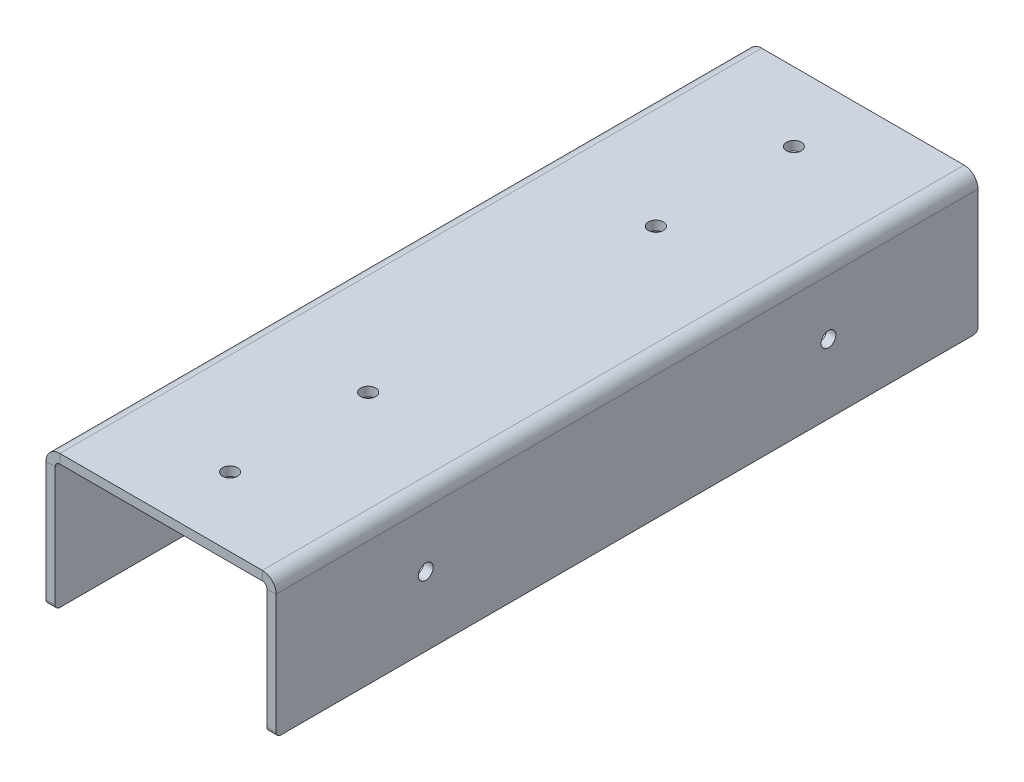
ISO-10303-21;
HEADER;
FILE_DESCRIPTION(('STEP AP214'),'2;1');
FILE_NAME('part.step','',(''),(''),'','','');
FILE_SCHEMA(('AUTOMOTIVE_DESIGN { 1 0 10303 214 1 1 1 1 }'));
ENDSEC;
DATA;
#1=APPLICATION_CONTEXT('core data for automotive mechanical design processes');
#2=APPLICATION_PROTOCOL_DEFINITION('international standard','automotive_design',2000,#1);
#3=PRODUCT_CONTEXT('',#1,'mechanical');
#4=PRODUCT('Part','Part','',(#3));
#5=PRODUCT_RELATED_PRODUCT_CATEGORY('part','',(#4));
#6=PRODUCT_DEFINITION_FORMATION('','',#4);
#7=PRODUCT_DEFINITION_CONTEXT('part definition',#1,'design');
#8=PRODUCT_DEFINITION('design','',#6,#7);
#9=PRODUCT_DEFINITION_SHAPE('','',#8);
#10=(LENGTH_UNIT() NAMED_UNIT(*) SI_UNIT(.MILLI.,.METRE.));
#11=(NAMED_UNIT(*) PLANE_ANGLE_UNIT() SI_UNIT($,.RADIAN.));
#12=(NAMED_UNIT(*) SI_UNIT($,.STERADIAN.) SOLID_ANGLE_UNIT());
#13=UNCERTAINTY_MEASURE_WITH_UNIT(LENGTH_MEASURE(1.E-05),#10,'distance_accuracy_value','');
#14=(GEOMETRIC_REPRESENTATION_CONTEXT(3) GLOBAL_UNCERTAINTY_ASSIGNED_CONTEXT((#13)) GLOBAL_UNIT_ASSIGNED_CONTEXT((#10,
#11,#12)) REPRESENTATION_CONTEXT('',''));
#15=CARTESIAN_POINT('',(0.,0.,0.));
#16=DIRECTION('',(0.,0.,1.));
#17=DIRECTION('',(1.,0.,0.));
#18=AXIS2_PLACEMENT_3D('',#15,#16,#17);
#19=CARTESIAN_POINT('',(-50.,-4.,152.5));
#20=DIRECTION('',(0.,0.,1.));
#21=DIRECTION('',(1.,0.,0.));
#22=AXIS2_PLACEMENT_3D('',#19,#20,#21);
#23=PLANE('',#22);
#24=DIRECTION('',(0.,-1.,0.));
#25=VECTOR('',#24,1.);
#26=CARTESIAN_POINT('',(44.,-4.,152.5));
#27=LINE('',#26,#25);
#28=CARTESIAN_POINT('',(44.,0.,152.5));
#29=VERTEX_POINT('',#28);
#30=CARTESIAN_POINT('',(44.,-4.,152.5));
#31=VERTEX_POINT('',#30);
#32=EDGE_CURVE('E263',#29,#31,#27,.T.);
#33=ORIENTED_EDGE('',*,*,#32,.F.);
#34=DIRECTION('',(1.,0.,0.));
#35=VECTOR('',#34,1.);
#36=CARTESIAN_POINT('',(-50.,0.,152.5));
#37=LINE('',#36,#35);
#38=CARTESIAN_POINT('',(-44.,0.,152.5));
#39=VERTEX_POINT('',#38);
#40=EDGE_CURVE('E238',#39,#29,#37,.T.);
#41=ORIENTED_EDGE('',*,*,#40,.F.);
#42=DIRECTION('',(0.,-1.,0.));
#43=VECTOR('',#42,1.);
#44=CARTESIAN_POINT('',(-44.,-4.,152.5));
#45=LINE('',#44,#43);
#46=CARTESIAN_POINT('',(-44.,-4.,152.5));
#47=VERTEX_POINT('',#46);
#48=EDGE_CURVE('E261',#39,#47,#45,.T.);
#49=ORIENTED_EDGE('',*,*,#48,.T.);
#50=DIRECTION('',(1.,0.,0.));
#51=VECTOR('',#50,1.);
#52=CARTESIAN_POINT('',(-50.,-4.,152.5));
#53=LINE('',#52,#51);
#54=EDGE_CURVE('E187',#47,#31,#53,.T.);
#55=ORIENTED_EDGE('',*,*,#54,.T.);
#56=EDGE_LOOP('',(#33,#41,#49,#55));
#57=FACE_BOUND('',#56,.T.);
#58=ADVANCED_FACE('F39',(#57),#23,.T.);
#59=CARTESIAN_POINT('',(-44.,-6.,152.5));
#60=DIRECTION('',(0.,0.,1.));
#61=DIRECTION('',(1.,0.,0.));
#62=AXIS2_PLACEMENT_3D('',#59,#60,#61);
#63=PLANE('',#62);
#64=ORIENTED_EDGE('',*,*,#48,.F.);
#65=CARTESIAN_POINT('',(-44.,-6.,152.5));
#66=DIRECTION('',(0.,0.,1.));
#67=DIRECTION('',(1.,0.,0.));
#68=AXIS2_PLACEMENT_3D('',#65,#66,#67);
#69=CIRCLE('',#68,6.);
#70=CARTESIAN_POINT('',(-50.,-5.99999999999999,152.5));
#71=VERTEX_POINT('',#70);
#72=EDGE_CURVE('E239',#39,#71,#69,.T.);
#73=ORIENTED_EDGE('',*,*,#72,.T.);
#74=DIRECTION('',(1.,0.,0.));
#75=VECTOR('',#74,1.);
#76=CARTESIAN_POINT('',(-46.,-6.,152.5));
#77=LINE('',#76,#75);
#78=CARTESIAN_POINT('',(-46.,-6.,152.5));
#79=VERTEX_POINT('',#78);
#80=EDGE_CURVE('E258',#71,#79,#77,.T.);
#81=ORIENTED_EDGE('',*,*,#80,.T.);
#82=CARTESIAN_POINT('',(-44.,-6.,152.5));
#83=DIRECTION('',(0.,0.,-1.));
#84=DIRECTION('',(-1.,0.,0.));
#85=AXIS2_PLACEMENT_3D('',#82,#83,#84);
#86=CIRCLE('',#85,2.);
#87=EDGE_CURVE('E178',#47,#79,#86,.F.);
#88=ORIENTED_EDGE('',*,*,#87,.F.);
#89=EDGE_LOOP('',(#64,#73,#81,#88));
#90=FACE_BOUND('',#89,.T.);
#91=ADVANCED_FACE('F403',(#90),#63,.T.);
#92=CARTESIAN_POINT('',(-46.,-60.,152.5));
#93=DIRECTION('',(0.,0.,1.));
#94=DIRECTION('',(0.,1.,0.));
#95=AXIS2_PLACEMENT_3D('',#92,#93,#94);
#96=PLANE('',#95);
#97=DIRECTION('',(0.,1.,0.));
#98=VECTOR('',#97,1.);
#99=CARTESIAN_POINT('',(-50.,-60.,152.5));
#100=LINE('',#99,#98);
#101=CARTESIAN_POINT('',(-50.,-58.,152.5));
#102=VERTEX_POINT('',#101);
#103=EDGE_CURVE('E243',#102,#71,#100,.T.);
#104=ORIENTED_EDGE('',*,*,#103,.F.);
#105=DIRECTION('',(-1.,0.,0.));
#106=VECTOR('',#105,1.);
#107=CARTESIAN_POINT('',(-46.,-58.,152.5));
#108=LINE('',#107,#106);
#109=CARTESIAN_POINT('',(-46.,-58.,152.5));
#110=VERTEX_POINT('',#109);
#111=EDGE_CURVE('E11',#102,#110,#108,.F.);
#112=ORIENTED_EDGE('',*,*,#111,.T.);
#113=DIRECTION('',(0.,1.,0.));
#114=VECTOR('',#113,1.);
#115=CARTESIAN_POINT('',(-46.,-60.,152.5));
#116=LINE('',#115,#114);
#117=EDGE_CURVE('E318',#110,#79,#116,.T.);
#118=ORIENTED_EDGE('',*,*,#117,.T.);
#119=ORIENTED_EDGE('',*,*,#80,.F.);
#120=EDGE_LOOP('',(#104,#112,#118,#119));
#121=FACE_BOUND('',#120,.T.);
#122=ADVANCED_FACE('F409',(#121),#96,.T.);
#123=CARTESIAN_POINT('',(-46.,-60.,152.5));
#124=DIRECTION('',(0.,1.,0.));
#125=DIRECTION('',(0.,0.,-1.));
#126=AXIS2_PLACEMENT_3D('',#123,#124,#125);
#127=PLANE('',#126);
#128=DIRECTION('',(0.,0.,1.));
#129=VECTOR('',#128,1.);
#130=CARTESIAN_POINT('',(-50.,-60.,152.5));
#131=LINE('',#130,#129);
#132=CARTESIAN_POINT('',(-50.,-60.,150.5));
#133=VERTEX_POINT('',#132);
#134=CARTESIAN_POINT('',(-50.,-60.,-150.5));
#135=VERTEX_POINT('',#134);
#136=EDGE_CURVE('E230',#133,#135,#131,.F.);
#137=ORIENTED_EDGE('',*,*,#136,.T.);
#138=DIRECTION('',(-1.,0.,0.));
#139=VECTOR('',#138,1.);
#140=CARTESIAN_POINT('',(-46.,-60.,-150.5));
#141=LINE('',#140,#139);
#142=CARTESIAN_POINT('',(-46.,-60.,-150.5));
#143=VERTEX_POINT('',#142);
#144=EDGE_CURVE('E268',#135,#143,#141,.F.);
#145=ORIENTED_EDGE('',*,*,#144,.T.);
#146=DIRECTION('',(0.,0.,-1.));
#147=VECTOR('',#146,1.);
#148=CARTESIAN_POINT('',(-46.,-60.,152.5));
#149=LINE('',#148,#147);
#150=CARTESIAN_POINT('',(-46.,-60.,150.5));
#151=VERTEX_POINT('',#150);
#152=EDGE_CURVE('E313',#151,#143,#149,.T.);
#153=ORIENTED_EDGE('',*,*,#152,.F.);
#154=DIRECTION('',(1.,0.,0.));
#155=VECTOR('',#154,1.);
#156=CARTESIAN_POINT('',(-46.,-60.,150.5));
#157=LINE('',#156,#155);
#158=EDGE_CURVE('E265',#151,#133,#157,.F.);
#159=ORIENTED_EDGE('',*,*,#158,.T.);
#160=EDGE_LOOP('',(#137,#145,#153,#159));
#161=FACE_BOUND('',#160,.T.);
#162=ADVANCED_FACE('F492',(#161),#127,.F.);
#163=CARTESIAN_POINT('',(-46.,-60.,-152.5));
#164=DIRECTION('',(0.,0.,1.));
#165=DIRECTION('',(0.,1.,0.));
#166=AXIS2_PLACEMENT_3D('',#163,#164,#165);
#167=PLANE('',#166);
#168=DIRECTION('',(0.,1.,0.));
#169=VECTOR('',#168,1.);
#170=CARTESIAN_POINT('',(-46.,-60.,-152.5));
#171=LINE('',#170,#169);
#172=CARTESIAN_POINT('',(-46.,-58.,-152.5));
#173=VERTEX_POINT('',#172);
#174=CARTESIAN_POINT('',(-46.,-6.,-152.5));
#175=VERTEX_POINT('',#174);
#176=EDGE_CURVE('E320',#173,#175,#171,.T.);
#177=ORIENTED_EDGE('',*,*,#176,.F.);
#178=DIRECTION('',(-1.,0.,0.));
#179=VECTOR('',#178,1.);
#180=CARTESIAN_POINT('',(-46.,-58.,-152.5));
#181=LINE('',#180,#179);
#182=CARTESIAN_POINT('',(-50.,-58.,-152.5));
#183=VERTEX_POINT('',#182);
#184=EDGE_CURVE('E275',#173,#183,#181,.T.);
#185=ORIENTED_EDGE('',*,*,#184,.T.);
#186=DIRECTION('',(0.,1.,0.));
#187=VECTOR('',#186,1.);
#188=CARTESIAN_POINT('',(-50.,-60.,-152.5));
#189=LINE('',#188,#187);
#190=CARTESIAN_POINT('',(-50.,-6.,-152.5));
#191=VERTEX_POINT('',#190);
#192=EDGE_CURVE('E241',#183,#191,#189,.T.);
#193=ORIENTED_EDGE('',*,*,#192,.T.);
#194=DIRECTION('',(1.,0.,0.));
#195=VECTOR('',#194,1.);
#196=CARTESIAN_POINT('',(-46.,-6.,-152.5));
#197=LINE('',#196,#195);
#198=EDGE_CURVE('E167',#191,#175,#197,.T.);
#199=ORIENTED_EDGE('',*,*,#198,.T.);
#200=EDGE_LOOP('',(#177,#185,#193,#199));
#201=FACE_BOUND('',#200,.T.);
#202=ADVANCED_FACE('F457',(#201),#167,.F.);
#203=CARTESIAN_POINT('',(-44.,-6.,-152.5));
#204=DIRECTION('',(0.,0.,-1.));
#205=DIRECTION('',(-1.,0.,0.));
#206=AXIS2_PLACEMENT_3D('',#203,#204,#205);
#207=PLANE('',#206);
#208=ORIENTED_EDGE('',*,*,#198,.F.);
#209=CARTESIAN_POINT('',(-44.,-6.,-152.5));
#210=DIRECTION('',(0.,0.,1.));
#211=DIRECTION('',(1.,0.,0.));
#212=AXIS2_PLACEMENT_3D('',#209,#210,#211);
#213=CIRCLE('',#212,6.);
#214=CARTESIAN_POINT('',(-44.,0.,-152.5));
#215=VERTEX_POINT('',#214);
#216=EDGE_CURVE('E162',#191,#215,#213,.F.);
#217=ORIENTED_EDGE('',*,*,#216,.T.);
#218=DIRECTION('',(0.,-1.,0.));
#219=VECTOR('',#218,1.);
#220=CARTESIAN_POINT('',(-44.,-4.,-152.5));
#221=LINE('',#220,#219);
#222=CARTESIAN_POINT('',(-44.,-4.,-152.5));
#223=VERTEX_POINT('',#222);
#224=EDGE_CURVE('E155',#215,#223,#221,.T.);
#225=ORIENTED_EDGE('',*,*,#224,.T.);
#226=CARTESIAN_POINT('',(-44.,-6.,-152.5));
#227=DIRECTION('',(0.,0.,1.));
#228=DIRECTION('',(1.,0.,0.));
#229=AXIS2_PLACEMENT_3D('',#226,#227,#228);
#230=CIRCLE('',#229,2.);
#231=EDGE_CURVE('E159',#175,#223,#230,.F.);
#232=ORIENTED_EDGE('',*,*,#231,.F.);
#233=EDGE_LOOP('',(#208,#217,#225,#232));
#234=FACE_BOUND('',#233,.T.);
#235=ADVANCED_FACE('F158',(#234),#207,.T.);
#236=CARTESIAN_POINT('',(-50.,-4.,-152.5));
#237=DIRECTION('',(0.,0.,1.));
#238=DIRECTION('',(1.,0.,0.));
#239=AXIS2_PLACEMENT_3D('',#236,#237,#238);
#240=PLANE('',#239);
#241=ORIENTED_EDGE('',*,*,#224,.F.);
#242=DIRECTION('',(1.,0.,0.));
#243=VECTOR('',#242,1.);
#244=CARTESIAN_POINT('',(-50.,0.,-152.5));
#245=LINE('',#244,#243);
#246=CARTESIAN_POINT('',(44.,0.,-152.5));
#247=VERTEX_POINT('',#246);
#248=EDGE_CURVE('E236',#215,#247,#245,.T.);
#249=ORIENTED_EDGE('',*,*,#248,.T.);
#250=DIRECTION('',(0.,-1.,0.));
#251=VECTOR('',#250,1.);
#252=CARTESIAN_POINT('',(44.,-4.,-152.5));
#253=LINE('',#252,#251);
#254=CARTESIAN_POINT('',(44.,-4.,-152.5));
#255=VERTEX_POINT('',#254);
#256=EDGE_CURVE('E168',#247,#255,#253,.T.);
#257=ORIENTED_EDGE('',*,*,#256,.T.);
#258=DIRECTION('',(1.,0.,0.));
#259=VECTOR('',#258,1.);
#260=CARTESIAN_POINT('',(-50.,-4.,-152.5));
#261=LINE('',#260,#259);
#262=EDGE_CURVE('E182',#223,#255,#261,.T.);
#263=ORIENTED_EDGE('',*,*,#262,.F.);
#264=EDGE_LOOP('',(#241,#249,#257,#263));
#265=FACE_BOUND('',#264,.T.);
#266=ADVANCED_FACE('F183',(#265),#240,.F.);
#267=CARTESIAN_POINT('',(44.,-6.,-152.5));
#268=DIRECTION('',(0.,0.,1.));
#269=DIRECTION('',(1.,0.,0.));
#270=AXIS2_PLACEMENT_3D('',#267,#268,#269);
#271=PLANE('',#270);
#272=ORIENTED_EDGE('',*,*,#256,.F.);
#273=CARTESIAN_POINT('',(44.,-6.,-152.5));
#274=DIRECTION('',(0.,0.,1.));
#275=DIRECTION('',(1.,0.,0.));
#276=AXIS2_PLACEMENT_3D('',#273,#274,#275);
#277=CIRCLE('',#276,6.);
#278=CARTESIAN_POINT('',(50.,-6.,-152.5));
#279=VERTEX_POINT('',#278);
#280=EDGE_CURVE('E231',#247,#279,#277,.F.);
#281=ORIENTED_EDGE('',*,*,#280,.T.);
#282=DIRECTION('',(-1.,0.,0.));
#283=VECTOR('',#282,1.);
#284=CARTESIAN_POINT('',(46.,-6.,-152.5));
#285=LINE('',#284,#283);
#286=CARTESIAN_POINT('',(46.,-6.,-152.5));
#287=VERTEX_POINT('',#286);
#288=EDGE_CURVE('E253',#279,#287,#285,.T.);
#289=ORIENTED_EDGE('',*,*,#288,.T.);
#290=CARTESIAN_POINT('',(44.,-6.,-152.5));
#291=DIRECTION('',(0.,0.,-1.));
#292=DIRECTION('',(-1.,0.,0.));
#293=AXIS2_PLACEMENT_3D('',#290,#291,#292);
#294=CIRCLE('',#293,2.);
#295=EDGE_CURVE('E207',#255,#287,#294,.T.);
#296=ORIENTED_EDGE('',*,*,#295,.F.);
#297=EDGE_LOOP('',(#272,#281,#289,#296));
#298=FACE_BOUND('',#297,.T.);
#299=ADVANCED_FACE('F441',(#298),#271,.F.);
#300=CARTESIAN_POINT('',(46.,0.,-152.5));
#301=DIRECTION('',(0.,0.,-1.));
#302=DIRECTION('',(0.,1.,0.));
#303=AXIS2_PLACEMENT_3D('',#300,#301,#302);
#304=PLANE('',#303);
#305=DIRECTION('',(0.,1.,0.));
#306=VECTOR('',#305,1.);
#307=CARTESIAN_POINT('',(50.,0.,-152.5));
#308=LINE('',#307,#306);
#309=CARTESIAN_POINT('',(50.,-58.,-152.5));
#310=VERTEX_POINT('',#309);
#311=EDGE_CURVE('E227',#279,#310,#308,.F.);
#312=ORIENTED_EDGE('',*,*,#311,.T.);
#313=DIRECTION('',(-1.,0.,0.));
#314=VECTOR('',#313,1.);
#315=CARTESIAN_POINT('',(46.,-58.,-152.5));
#316=LINE('',#315,#314);
#317=CARTESIAN_POINT('',(46.,-58.,-152.5));
#318=VERTEX_POINT('',#317);
#319=EDGE_CURVE('E281',#310,#318,#316,.T.);
#320=ORIENTED_EDGE('',*,*,#319,.T.);
#321=DIRECTION('',(0.,1.,0.));
#322=VECTOR('',#321,1.);
#323=CARTESIAN_POINT('',(46.,0.,-152.5));
#324=LINE('',#323,#322);
#325=EDGE_CURVE('E310',#287,#318,#324,.F.);
#326=ORIENTED_EDGE('',*,*,#325,.F.);
#327=ORIENTED_EDGE('',*,*,#288,.F.);
#328=EDGE_LOOP('',(#312,#320,#326,#327));
#329=FACE_BOUND('',#328,.T.);
#330=ADVANCED_FACE('F303',(#329),#304,.T.);
#331=CARTESIAN_POINT('',(46.,-60.,152.5));
#332=DIRECTION('',(0.,-1.,0.));
#333=DIRECTION('',(0.,0.,-1.));
#334=AXIS2_PLACEMENT_3D('',#331,#332,#333);
#335=PLANE('',#334);
#336=DIRECTION('',(0.,0.,-1.));
#337=VECTOR('',#336,1.);
#338=CARTESIAN_POINT('',(46.,-60.,152.5));
#339=LINE('',#338,#337);
#340=CARTESIAN_POINT('',(46.,-60.,150.5));
#341=VERTEX_POINT('',#340);
#342=CARTESIAN_POINT('',(46.,-60.,-150.5));
#343=VERTEX_POINT('',#342);
#344=EDGE_CURVE('E197',#341,#343,#339,.T.);
#345=ORIENTED_EDGE('',*,*,#344,.T.);
#346=DIRECTION('',(-1.,0.,0.));
#347=VECTOR('',#346,1.);
#348=CARTESIAN_POINT('',(46.,-60.,-150.5));
#349=LINE('',#348,#347);
#350=CARTESIAN_POINT('',(50.,-60.,-150.5));
#351=VERTEX_POINT('',#350);
#352=EDGE_CURVE('E61',#343,#351,#349,.F.);
#353=ORIENTED_EDGE('',*,*,#352,.T.);
#354=DIRECTION('',(0.,0.,-1.));
#355=VECTOR('',#354,1.);
#356=CARTESIAN_POINT('',(50.,-60.,152.5));
#357=LINE('',#356,#355);
#358=CARTESIAN_POINT('',(50.,-60.,150.5));
#359=VERTEX_POINT('',#358);
#360=EDGE_CURVE('E225',#359,#351,#357,.T.);
#361=ORIENTED_EDGE('',*,*,#360,.F.);
#362=DIRECTION('',(1.,0.,0.));
#363=VECTOR('',#362,1.);
#364=CARTESIAN_POINT('',(46.,-60.,150.5));
#365=LINE('',#364,#363);
#366=EDGE_CURVE('E288',#359,#341,#365,.F.);
#367=ORIENTED_EDGE('',*,*,#366,.T.);
#368=EDGE_LOOP('',(#345,#353,#361,#367));
#369=FACE_BOUND('',#368,.T.);
#370=ADVANCED_FACE('F311',(#369),#335,.T.);
#371=CARTESIAN_POINT('',(46.,0.,152.5));
#372=DIRECTION('',(0.,0.,-1.));
#373=DIRECTION('',(0.,1.,0.));
#374=AXIS2_PLACEMENT_3D('',#371,#372,#373);
#375=PLANE('',#374);
#376=DIRECTION('',(0.,1.,0.));
#377=VECTOR('',#376,1.);
#378=CARTESIAN_POINT('',(46.,0.,152.5));
#379=LINE('',#378,#377);
#380=CARTESIAN_POINT('',(46.,-6.,152.5));
#381=VERTEX_POINT('',#380);
#382=CARTESIAN_POINT('',(46.,-58.,152.5));
#383=VERTEX_POINT('',#382);
#384=EDGE_CURVE('E193',#381,#383,#379,.F.);
#385=ORIENTED_EDGE('',*,*,#384,.T.);
#386=DIRECTION('',(-1.,0.,0.));
#387=VECTOR('',#386,1.);
#388=CARTESIAN_POINT('',(46.,-58.,152.5));
#389=LINE('',#388,#387);
#390=CARTESIAN_POINT('',(50.,-58.,152.5));
#391=VERTEX_POINT('',#390);
#392=EDGE_CURVE('E47',#383,#391,#389,.F.);
#393=ORIENTED_EDGE('',*,*,#392,.T.);
#394=DIRECTION('',(0.,1.,0.));
#395=VECTOR('',#394,1.);
#396=CARTESIAN_POINT('',(50.,0.,152.5));
#397=LINE('',#396,#395);
#398=CARTESIAN_POINT('',(50.,-6.,152.5));
#399=VERTEX_POINT('',#398);
#400=EDGE_CURVE('E221',#399,#391,#397,.F.);
#401=ORIENTED_EDGE('',*,*,#400,.F.);
#402=DIRECTION('',(-1.,0.,0.));
#403=VECTOR('',#402,1.);
#404=CARTESIAN_POINT('',(46.,-6.,152.5));
#405=LINE('',#404,#403);
#406=EDGE_CURVE('E206',#399,#381,#405,.T.);
#407=ORIENTED_EDGE('',*,*,#406,.T.);
#408=EDGE_LOOP('',(#385,#393,#401,#407));
#409=FACE_BOUND('',#408,.T.);
#410=ADVANCED_FACE('F416',(#409),#375,.F.);
#411=CARTESIAN_POINT('',(44.,-6.,152.5));
#412=DIRECTION('',(0.,0.,-1.));
#413=DIRECTION('',(-1.,0.,0.));
#414=AXIS2_PLACEMENT_3D('',#411,#412,#413);
#415=PLANE('',#414);
#416=CARTESIAN_POINT('',(44.,-6.,152.5));
#417=DIRECTION('',(0.,0.,1.));
#418=DIRECTION('',(1.,0.,0.));
#419=AXIS2_PLACEMENT_3D('',#416,#417,#418);
#420=CIRCLE('',#419,6.);
#421=EDGE_CURVE('E234',#399,#29,#420,.T.);
#422=ORIENTED_EDGE('',*,*,#421,.T.);
#423=ORIENTED_EDGE('',*,*,#32,.T.);
#424=CARTESIAN_POINT('',(44.,-6.,152.5));
#425=DIRECTION('',(0.,0.,1.));
#426=DIRECTION('',(1.,0.,0.));
#427=AXIS2_PLACEMENT_3D('',#424,#425,#426);
#428=CIRCLE('',#427,2.);
#429=EDGE_CURVE('E179',#381,#31,#428,.T.);
#430=ORIENTED_EDGE('',*,*,#429,.F.);
#431=ORIENTED_EDGE('',*,*,#406,.F.);
#432=EDGE_LOOP('',(#422,#423,#430,#431));
#433=FACE_BOUND('',#432,.T.);
#434=ADVANCED_FACE('F384',(#433),#415,.F.);
#435=CARTESIAN_POINT('',(46.,0.,152.5));
#436=DIRECTION('',(1.,0.,0.));
#437=DIRECTION('',(0.,0.,-1.));
#438=AXIS2_PLACEMENT_3D('',#435,#436,#437);
#439=PLANE('',#438);
#440=CARTESIAN_POINT('',(46.,-30.,-87.5));
#441=DIRECTION('',(1.,0.,0.));
#442=DIRECTION('',(0.,0.,-1.));
#443=AXIS2_PLACEMENT_3D('',#440,#441,#442);
#444=CIRCLE('',#443,3.24999999999993);
#445=CARTESIAN_POINT('',(46.,-30.,-90.7499999999999));
#446=VERTEX_POINT('',#445);
#447=EDGE_CURVE('E358',#446,#446,#444,.T.);
#448=ORIENTED_EDGE('',*,*,#447,.T.);
#449=EDGE_LOOP('',(#448));
#450=FACE_BOUND('',#449,.T.);
#451=CARTESIAN_POINT('',(46.,-30.,87.5));
#452=DIRECTION('',(1.,0.,0.));
#453=DIRECTION('',(0.,0.,-1.));
#454=AXIS2_PLACEMENT_3D('',#451,#452,#453);
#455=CIRCLE('',#454,3.24999999999993);
#456=CARTESIAN_POINT('',(46.,-30.,84.2500000000001));
#457=VERTEX_POINT('',#456);
#458=EDGE_CURVE('E346',#457,#457,#455,.T.);
#459=ORIENTED_EDGE('',*,*,#458,.T.);
#460=EDGE_LOOP('',(#459));
#461=FACE_BOUND('',#460,.T.);
#462=ORIENTED_EDGE('',*,*,#325,.T.);
#463=CARTESIAN_POINT('',(46.,-58.,-150.5));
#464=DIRECTION('',(1.,0.,0.));
#465=DIRECTION('',(0.,0.,-1.));
#466=AXIS2_PLACEMENT_3D('',#463,#464,#465);
#467=CIRCLE('',#466,2.);
#468=EDGE_CURVE('E286',#318,#343,#467,.F.);
#469=ORIENTED_EDGE('',*,*,#468,.T.);
#470=ORIENTED_EDGE('',*,*,#344,.F.);
#471=CARTESIAN_POINT('',(46.,-58.,150.5));
#472=DIRECTION('',(1.,0.,0.));
#473=DIRECTION('',(0.,0.,-1.));
#474=AXIS2_PLACEMENT_3D('',#471,#472,#473);
#475=CIRCLE('',#474,2.);
#476=EDGE_CURVE('E284',#341,#383,#475,.F.);
#477=ORIENTED_EDGE('',*,*,#476,.T.);
#478=ORIENTED_EDGE('',*,*,#384,.F.);
#479=DIRECTION('',(0.,0.,-1.));
#480=VECTOR('',#479,1.);
#481=CARTESIAN_POINT('',(46.,-6.,-152.5));
#482=LINE('',#481,#480);
#483=EDGE_CURVE('E195',#381,#287,#482,.T.);
#484=ORIENTED_EDGE('',*,*,#483,.T.);
#485=EDGE_LOOP('',(#462,#469,#470,#477,#478,#484));
#486=FACE_BOUND('',#485,.T.);
#487=ADVANCED_FACE('F309',(#450,#461,#486),#439,.F.);
#488=CARTESIAN_POINT('',(-46.,-60.,152.5));
#489=DIRECTION('',(-1.,0.,0.));
#490=DIRECTION('',(0.,0.,1.));
#491=AXIS2_PLACEMENT_3D('',#488,#489,#490);
#492=PLANE('',#491);
#493=CARTESIAN_POINT('',(-46.,-30.,-87.5));
#494=DIRECTION('',(-1.,0.,0.));
#495=DIRECTION('',(0.,0.,1.));
#496=AXIS2_PLACEMENT_3D('',#493,#494,#495);
#497=CIRCLE('',#496,3.24999999999993);
#498=CARTESIAN_POINT('',(-46.,-30.,-84.2500000000001));
#499=VERTEX_POINT('',#498);
#500=EDGE_CURVE('E361',#499,#499,#497,.T.);
#501=ORIENTED_EDGE('',*,*,#500,.T.);
#502=EDGE_LOOP('',(#501));
#503=FACE_BOUND('',#502,.T.);
#504=CARTESIAN_POINT('',(-46.,-30.,87.5));
#505=DIRECTION('',(-1.,0.,0.));
#506=DIRECTION('',(0.,0.,1.));
#507=AXIS2_PLACEMENT_3D('',#504,#505,#506);
#508=CIRCLE('',#507,3.24999999999993);
#509=CARTESIAN_POINT('',(-46.,-30.,90.7499999999999));
#510=VERTEX_POINT('',#509);
#511=EDGE_CURVE('E349',#510,#510,#508,.T.);
#512=ORIENTED_EDGE('',*,*,#511,.T.);
#513=EDGE_LOOP('',(#512));
#514=FACE_BOUND('',#513,.T.);
#515=ORIENTED_EDGE('',*,*,#152,.T.);
#516=CARTESIAN_POINT('',(-46.,-58.,-150.5));
#517=DIRECTION('',(-1.,0.,0.));
#518=DIRECTION('',(0.,0.,1.));
#519=AXIS2_PLACEMENT_3D('',#516,#517,#518);
#520=CIRCLE('',#519,2.);
#521=EDGE_CURVE('E273',#143,#173,#520,.F.);
#522=ORIENTED_EDGE('',*,*,#521,.T.);
#523=ORIENTED_EDGE('',*,*,#176,.T.);
#524=DIRECTION('',(0.,0.,-1.));
#525=VECTOR('',#524,1.);
#526=CARTESIAN_POINT('',(-46.,-6.,152.5));
#527=LINE('',#526,#525);
#528=EDGE_CURVE('E177',#175,#79,#527,.F.);
#529=ORIENTED_EDGE('',*,*,#528,.T.);
#530=ORIENTED_EDGE('',*,*,#117,.F.);
#531=CARTESIAN_POINT('',(-46.,-58.,150.5));
#532=DIRECTION('',(-1.,0.,0.));
#533=DIRECTION('',(0.,0.,1.));
#534=AXIS2_PLACEMENT_3D('',#531,#532,#533);
#535=CIRCLE('',#534,2.);
#536=EDGE_CURVE('E271',#110,#151,#535,.F.);
#537=ORIENTED_EDGE('',*,*,#536,.T.);
#538=EDGE_LOOP('',(#515,#522,#523,#529,#530,#537));
#539=FACE_BOUND('',#538,.T.);
#540=ADVANCED_FACE('F383',(#503,#514,#539),#492,.F.);
#541=CARTESIAN_POINT('',(-50.,-4.,152.5));
#542=DIRECTION('',(0.,1.,0.));
#543=DIRECTION('',(0.,0.,1.));
#544=AXIS2_PLACEMENT_3D('',#541,#542,#543);
#545=PLANE('',#544);
#546=CARTESIAN_POINT('',(0.,-4.,-122.5));
#547=DIRECTION('',(0.,1.,0.));
#548=DIRECTION('',(0.,0.,1.));
#549=AXIS2_PLACEMENT_3D('',#546,#547,#548);
#550=CIRCLE('',#549,3.24999999999997);
#551=CARTESIAN_POINT('',(0.,-4.,-119.25));
#552=VERTEX_POINT('',#551);
#553=EDGE_CURVE('E340',#552,#552,#550,.T.);
#554=ORIENTED_EDGE('',*,*,#553,.T.);
#555=EDGE_LOOP('',(#554));
#556=FACE_BOUND('',#555,.T.);
#557=CARTESIAN_POINT('',(0.,-4.,-62.5));
#558=DIRECTION('',(0.,1.,0.));
#559=DIRECTION('',(0.,0.,1.));
#560=AXIS2_PLACEMENT_3D('',#557,#558,#559);
#561=CIRCLE('',#560,3.24999999999997);
#562=CARTESIAN_POINT('',(0.,-4.,-59.25));
#563=VERTEX_POINT('',#562);
#564=EDGE_CURVE('E334',#563,#563,#561,.T.);
#565=ORIENTED_EDGE('',*,*,#564,.T.);
#566=EDGE_LOOP('',(#565));
#567=FACE_BOUND('',#566,.T.);
#568=CARTESIAN_POINT('',(0.,-4.,62.4999999999999));
#569=DIRECTION('',(0.,1.,0.));
#570=DIRECTION('',(0.,0.,1.));
#571=AXIS2_PLACEMENT_3D('',#568,#569,#570);
#572=CIRCLE('',#571,3.24999999999997);
#573=CARTESIAN_POINT('',(0.,-4.,65.7499999999999));
#574=VERTEX_POINT('',#573);
#575=EDGE_CURVE('E328',#574,#574,#572,.T.);
#576=ORIENTED_EDGE('',*,*,#575,.T.);
#577=EDGE_LOOP('',(#576));
#578=FACE_BOUND('',#577,.T.);
#579=CARTESIAN_POINT('',(0.,-4.,122.5));
#580=DIRECTION('',(0.,1.,0.));
#581=DIRECTION('',(0.,0.,1.));
#582=AXIS2_PLACEMENT_3D('',#579,#580,#581);
#583=CIRCLE('',#582,3.24999999999997);
#584=CARTESIAN_POINT('',(0.,-4.,125.75));
#585=VERTEX_POINT('',#584);
#586=EDGE_CURVE('E235',#585,#585,#583,.T.);
#587=ORIENTED_EDGE('',*,*,#586,.T.);
#588=EDGE_LOOP('',(#587));
#589=FACE_BOUND('',#588,.T.);
#590=ORIENTED_EDGE('',*,*,#262,.T.);
#591=DIRECTION('',(0.,0.,-1.));
#592=VECTOR('',#591,1.);
#593=CARTESIAN_POINT('',(44.,-4.,152.5));
#594=LINE('',#593,#592);
#595=EDGE_CURVE('E204',#255,#31,#594,.F.);
#596=ORIENTED_EDGE('',*,*,#595,.T.);
#597=ORIENTED_EDGE('',*,*,#54,.F.);
#598=DIRECTION('',(0.,0.,-1.));
#599=VECTOR('',#598,1.);
#600=CARTESIAN_POINT('',(-44.,-4.,-152.5));
#601=LINE('',#600,#599);
#602=EDGE_CURVE('E175',#47,#223,#601,.T.);
#603=ORIENTED_EDGE('',*,*,#602,.T.);
#604=EDGE_LOOP('',(#590,#596,#597,#603));
#605=FACE_BOUND('',#604,.T.);
#606=ADVANCED_FACE('F190',(#556,#567,#578,#589,#605),#545,.F.);
#607=CARTESIAN_POINT('',(-44.,-6.,152.5));
#608=DIRECTION('',(0.,0.,1.));
#609=DIRECTION('',(1.,0.,0.));
#610=AXIS2_PLACEMENT_3D('',#607,#608,#609);
#611=CYLINDRICAL_SURFACE('',#610,2.);
#612=ORIENTED_EDGE('',*,*,#87,.T.);
#613=ORIENTED_EDGE('',*,*,#528,.F.);
#614=ORIENTED_EDGE('',*,*,#231,.T.);
#615=ORIENTED_EDGE('',*,*,#602,.F.);
#616=EDGE_LOOP('',(#612,#613,#614,#615));
#617=FACE_BOUND('',#616,.T.);
#618=ADVANCED_FACE('F173',(#617),#611,.F.);
#619=CARTESIAN_POINT('',(44.,-6.,152.5));
#620=DIRECTION('',(0.,0.,1.));
#621=DIRECTION('',(1.,0.,0.));
#622=AXIS2_PLACEMENT_3D('',#619,#620,#621);
#623=CYLINDRICAL_SURFACE('',#622,2.);
#624=ORIENTED_EDGE('',*,*,#429,.T.);
#625=ORIENTED_EDGE('',*,*,#595,.F.);
#626=ORIENTED_EDGE('',*,*,#295,.T.);
#627=ORIENTED_EDGE('',*,*,#483,.F.);
#628=EDGE_LOOP('',(#624,#625,#626,#627));
#629=FACE_BOUND('',#628,.T.);
#630=ADVANCED_FACE('F439',(#629),#623,.F.);
#631=CARTESIAN_POINT('',(50.,0.,152.5));
#632=DIRECTION('',(1.,0.,0.));
#633=DIRECTION('',(0.,0.,-1.));
#634=AXIS2_PLACEMENT_3D('',#631,#632,#633);
#635=PLANE('',#634);
#636=CARTESIAN_POINT('',(50.,-30.,-87.5));
#637=DIRECTION('',(-1.,0.,0.));
#638=DIRECTION('',(0.,0.,1.));
#639=AXIS2_PLACEMENT_3D('',#636,#637,#638);
#640=CIRCLE('',#639,3.24999999999987);
#641=CARTESIAN_POINT('',(50.,-30.,-84.2500000000001));
#642=VERTEX_POINT('',#641);
#643=EDGE_CURVE('E367',#642,#642,#640,.T.);
#644=ORIENTED_EDGE('',*,*,#643,.T.);
#645=EDGE_LOOP('',(#644));
#646=FACE_BOUND('',#645,.T.);
#647=CARTESIAN_POINT('',(50.,-30.,87.5));
#648=DIRECTION('',(-1.,0.,0.));
#649=DIRECTION('',(0.,0.,1.));
#650=AXIS2_PLACEMENT_3D('',#647,#648,#649);
#651=CIRCLE('',#650,3.24999999999987);
#652=CARTESIAN_POINT('',(50.,-30.,90.7499999999999));
#653=VERTEX_POINT('',#652);
#654=EDGE_CURVE('E355',#653,#653,#651,.T.);
#655=ORIENTED_EDGE('',*,*,#654,.T.);
#656=EDGE_LOOP('',(#655));
#657=FACE_BOUND('',#656,.T.);
#658=ORIENTED_EDGE('',*,*,#360,.T.);
#659=CARTESIAN_POINT('',(50.,-58.,-150.5));
#660=DIRECTION('',(1.,0.,0.));
#661=DIRECTION('',(0.,0.,-1.));
#662=AXIS2_PLACEMENT_3D('',#659,#660,#661);
#663=CIRCLE('',#662,2.);
#664=EDGE_CURVE('E294',#351,#310,#663,.T.);
#665=ORIENTED_EDGE('',*,*,#664,.T.);
#666=ORIENTED_EDGE('',*,*,#311,.F.);
#667=DIRECTION('',(0.,0.,-1.));
#668=VECTOR('',#667,1.);
#669=CARTESIAN_POINT('',(50.,-6.,152.5));
#670=LINE('',#669,#668);
#671=EDGE_CURVE('E213',#399,#279,#670,.T.);
#672=ORIENTED_EDGE('',*,*,#671,.F.);
#673=ORIENTED_EDGE('',*,*,#400,.T.);
#674=CARTESIAN_POINT('',(50.,-58.,150.5));
#675=DIRECTION('',(1.,0.,0.));
#676=DIRECTION('',(0.,0.,-1.));
#677=AXIS2_PLACEMENT_3D('',#674,#675,#676);
#678=CIRCLE('',#677,2.);
#679=EDGE_CURVE('E292',#391,#359,#678,.T.);
#680=ORIENTED_EDGE('',*,*,#679,.T.);
#681=EDGE_LOOP('',(#658,#665,#666,#672,#673,#680));
#682=FACE_BOUND('',#681,.T.);
#683=ADVANCED_FACE('F298',(#646,#657,#682),#635,.T.);
#684=CARTESIAN_POINT('',(-50.,-60.,152.5));
#685=DIRECTION('',(-1.,0.,0.));
#686=DIRECTION('',(0.,0.,1.));
#687=AXIS2_PLACEMENT_3D('',#684,#685,#686);
#688=PLANE('',#687);
#689=CARTESIAN_POINT('',(-50.,-30.,-87.5));
#690=DIRECTION('',(-1.,0.,0.));
#691=DIRECTION('',(0.,0.,1.));
#692=AXIS2_PLACEMENT_3D('',#689,#690,#691);
#693=CIRCLE('',#692,3.24999999999993);
#694=CARTESIAN_POINT('',(-50.,-30.,-84.2500000000001));
#695=VERTEX_POINT('',#694);
#696=EDGE_CURVE('E364',#695,#695,#693,.T.);
#697=ORIENTED_EDGE('',*,*,#696,.F.);
#698=EDGE_LOOP('',(#697));
#699=FACE_BOUND('',#698,.T.);
#700=CARTESIAN_POINT('',(-50.,-30.,87.5));
#701=DIRECTION('',(-1.,0.,0.));
#702=DIRECTION('',(0.,0.,1.));
#703=AXIS2_PLACEMENT_3D('',#700,#701,#702);
#704=CIRCLE('',#703,3.24999999999993);
#705=CARTESIAN_POINT('',(-50.,-30.,90.7499999999999));
#706=VERTEX_POINT('',#705);
#707=EDGE_CURVE('E352',#706,#706,#704,.T.);
#708=ORIENTED_EDGE('',*,*,#707,.F.);
#709=EDGE_LOOP('',(#708));
#710=FACE_BOUND('',#709,.T.);
#711=ORIENTED_EDGE('',*,*,#192,.F.);
#712=CARTESIAN_POINT('',(-50.,-58.,-150.5));
#713=DIRECTION('',(-1.,0.,0.));
#714=DIRECTION('',(0.,0.,1.));
#715=AXIS2_PLACEMENT_3D('',#712,#713,#714);
#716=CIRCLE('',#715,2.);
#717=EDGE_CURVE('E279',#183,#135,#716,.T.);
#718=ORIENTED_EDGE('',*,*,#717,.T.);
#719=ORIENTED_EDGE('',*,*,#136,.F.);
#720=CARTESIAN_POINT('',(-50.,-58.,150.5));
#721=DIRECTION('',(-1.,0.,0.));
#722=DIRECTION('',(0.,0.,1.));
#723=AXIS2_PLACEMENT_3D('',#720,#721,#722);
#724=CIRCLE('',#723,2.);
#725=EDGE_CURVE('E277',#133,#102,#724,.T.);
#726=ORIENTED_EDGE('',*,*,#725,.T.);
#727=ORIENTED_EDGE('',*,*,#103,.T.);
#728=DIRECTION('',(0.,0.,1.));
#729=VECTOR('',#728,1.);
#730=CARTESIAN_POINT('',(-50.,-6.,152.5));
#731=LINE('',#730,#729);
#732=EDGE_CURVE('E216',#191,#71,#731,.T.);
#733=ORIENTED_EDGE('',*,*,#732,.F.);
#734=EDGE_LOOP('',(#711,#718,#719,#726,#727,#733));
#735=FACE_BOUND('',#734,.T.);
#736=ADVANCED_FACE('F461',(#699,#710,#735),#688,.T.);
#737=CARTESIAN_POINT('',(-50.,0.,152.5));
#738=DIRECTION('',(0.,1.,0.));
#739=DIRECTION('',(0.,0.,1.));
#740=AXIS2_PLACEMENT_3D('',#737,#738,#739);
#741=PLANE('',#740);
#742=CARTESIAN_POINT('',(0.,0.,-122.5));
#743=DIRECTION('',(0.,1.,0.));
#744=DIRECTION('',(0.,0.,1.));
#745=AXIS2_PLACEMENT_3D('',#742,#743,#744);
#746=CIRCLE('',#745,3.24999999999999);
#747=CARTESIAN_POINT('',(0.,0.,-119.25));
#748=VERTEX_POINT('',#747);
#749=EDGE_CURVE('E343',#748,#748,#746,.T.);
#750=ORIENTED_EDGE('',*,*,#749,.F.);
#751=EDGE_LOOP('',(#750));
#752=FACE_BOUND('',#751,.T.);
#753=CARTESIAN_POINT('',(0.,0.,-62.5));
#754=DIRECTION('',(0.,1.,0.));
#755=DIRECTION('',(0.,0.,1.));
#756=AXIS2_PLACEMENT_3D('',#753,#754,#755);
#757=CIRCLE('',#756,3.24999999999999);
#758=CARTESIAN_POINT('',(0.,0.,-59.25));
#759=VERTEX_POINT('',#758);
#760=EDGE_CURVE('E337',#759,#759,#757,.T.);
#761=ORIENTED_EDGE('',*,*,#760,.F.);
#762=EDGE_LOOP('',(#761));
#763=FACE_BOUND('',#762,.T.);
#764=CARTESIAN_POINT('',(0.,0.,62.4999999999999));
#765=DIRECTION('',(0.,1.,0.));
#766=DIRECTION('',(0.,0.,1.));
#767=AXIS2_PLACEMENT_3D('',#764,#765,#766);
#768=CIRCLE('',#767,3.24999999999999);
#769=CARTESIAN_POINT('',(0.,0.,65.7499999999999));
#770=VERTEX_POINT('',#769);
#771=EDGE_CURVE('E331',#770,#770,#768,.T.);
#772=ORIENTED_EDGE('',*,*,#771,.F.);
#773=EDGE_LOOP('',(#772));
#774=FACE_BOUND('',#773,.T.);
#775=CARTESIAN_POINT('',(0.,0.,122.5));
#776=DIRECTION('',(0.,1.,0.));
#777=DIRECTION('',(0.,0.,1.));
#778=AXIS2_PLACEMENT_3D('',#775,#776,#777);
#779=CIRCLE('',#778,3.24999999999999);
#780=CARTESIAN_POINT('',(0.,0.,125.75));
#781=VERTEX_POINT('',#780);
#782=EDGE_CURVE('E325',#781,#781,#779,.T.);
#783=ORIENTED_EDGE('',*,*,#782,.F.);
#784=EDGE_LOOP('',(#783));
#785=FACE_BOUND('',#784,.T.);
#786=ORIENTED_EDGE('',*,*,#248,.F.);
#787=DIRECTION('',(0.,0.,1.));
#788=VECTOR('',#787,1.);
#789=CARTESIAN_POINT('',(-44.,0.,152.5));
#790=LINE('',#789,#788);
#791=EDGE_CURVE('E219',#39,#215,#790,.F.);
#792=ORIENTED_EDGE('',*,*,#791,.F.);
#793=ORIENTED_EDGE('',*,*,#40,.T.);
#794=DIRECTION('',(0.,0.,1.));
#795=VECTOR('',#794,1.);
#796=CARTESIAN_POINT('',(44.,0.,152.5));
#797=LINE('',#796,#795);
#798=EDGE_CURVE('E210',#247,#29,#797,.T.);
#799=ORIENTED_EDGE('',*,*,#798,.F.);
#800=EDGE_LOOP('',(#786,#792,#793,#799));
#801=FACE_BOUND('',#800,.T.);
#802=ADVANCED_FACE('F448',(#752,#763,#774,#785,#801),#741,.T.);
#803=CARTESIAN_POINT('',(-44.,-6.,152.5));
#804=DIRECTION('',(0.,0.,1.));
#805=DIRECTION('',(1.,0.,0.));
#806=AXIS2_PLACEMENT_3D('',#803,#804,#805);
#807=CYLINDRICAL_SURFACE('',#806,6.);
#808=ORIENTED_EDGE('',*,*,#72,.F.);
#809=ORIENTED_EDGE('',*,*,#791,.T.);
#810=ORIENTED_EDGE('',*,*,#216,.F.);
#811=ORIENTED_EDGE('',*,*,#732,.T.);
#812=EDGE_LOOP('',(#808,#809,#810,#811));
#813=FACE_BOUND('',#812,.T.);
#814=ADVANCED_FACE('F465',(#813),#807,.T.);
#815=CARTESIAN_POINT('',(44.,-6.,152.5));
#816=DIRECTION('',(0.,0.,1.));
#817=DIRECTION('',(1.,0.,0.));
#818=AXIS2_PLACEMENT_3D('',#815,#816,#817);
#819=CYLINDRICAL_SURFACE('',#818,6.);
#820=ORIENTED_EDGE('',*,*,#421,.F.);
#821=ORIENTED_EDGE('',*,*,#671,.T.);
#822=ORIENTED_EDGE('',*,*,#280,.F.);
#823=ORIENTED_EDGE('',*,*,#798,.T.);
#824=EDGE_LOOP('',(#820,#821,#822,#823));
#825=FACE_BOUND('',#824,.T.);
#826=ADVANCED_FACE('F421',(#825),#819,.T.);
#827=CARTESIAN_POINT('',(-46.,-58.,-150.5));
#828=DIRECTION('',(1.,0.,0.));
#829=DIRECTION('',(0.,0.,-1.));
#830=AXIS2_PLACEMENT_3D('',#827,#828,#829);
#831=CYLINDRICAL_SURFACE('',#830,2.);
#832=ORIENTED_EDGE('',*,*,#717,.F.);
#833=ORIENTED_EDGE('',*,*,#184,.F.);
#834=ORIENTED_EDGE('',*,*,#521,.F.);
#835=ORIENTED_EDGE('',*,*,#144,.F.);
#836=EDGE_LOOP('',(#832,#833,#834,#835));
#837=FACE_BOUND('',#836,.T.);
#838=ADVANCED_FACE('F418',(#837),#831,.T.);
#839=CARTESIAN_POINT('',(46.,-58.,-150.5));
#840=DIRECTION('',(-1.,0.,0.));
#841=DIRECTION('',(0.,0.,1.));
#842=AXIS2_PLACEMENT_3D('',#839,#840,#841);
#843=CYLINDRICAL_SURFACE('',#842,2.);
#844=ORIENTED_EDGE('',*,*,#664,.F.);
#845=ORIENTED_EDGE('',*,*,#352,.F.);
#846=ORIENTED_EDGE('',*,*,#468,.F.);
#847=ORIENTED_EDGE('',*,*,#319,.F.);
#848=EDGE_LOOP('',(#844,#845,#846,#847));
#849=FACE_BOUND('',#848,.T.);
#850=ADVANCED_FACE('F306',(#849),#843,.T.);
#851=CARTESIAN_POINT('',(46.,-58.,150.5));
#852=DIRECTION('',(1.,0.,0.));
#853=DIRECTION('',(0.,0.,-1.));
#854=AXIS2_PLACEMENT_3D('',#851,#852,#853);
#855=CYLINDRICAL_SURFACE('',#854,2.);
#856=ORIENTED_EDGE('',*,*,#679,.F.);
#857=ORIENTED_EDGE('',*,*,#392,.F.);
#858=ORIENTED_EDGE('',*,*,#476,.F.);
#859=ORIENTED_EDGE('',*,*,#366,.F.);
#860=EDGE_LOOP('',(#856,#857,#858,#859));
#861=FACE_BOUND('',#860,.T.);
#862=ADVANCED_FACE('F424',(#861),#855,.T.);
#863=CARTESIAN_POINT('',(-46.,-58.,150.5));
#864=DIRECTION('',(-1.,0.,0.));
#865=DIRECTION('',(0.,0.,1.));
#866=AXIS2_PLACEMENT_3D('',#863,#864,#865);
#867=CYLINDRICAL_SURFACE('',#866,2.);
#868=ORIENTED_EDGE('',*,*,#725,.F.);
#869=ORIENTED_EDGE('',*,*,#158,.F.);
#870=ORIENTED_EDGE('',*,*,#536,.F.);
#871=ORIENTED_EDGE('',*,*,#111,.F.);
#872=EDGE_LOOP('',(#868,#869,#870,#871));
#873=FACE_BOUND('',#872,.T.);
#874=ADVANCED_FACE('F41',(#873),#867,.T.);
#875=CARTESIAN_POINT('',(0.,0.,122.5));
#876=DIRECTION('',(0.,1.,0.));
#877=DIRECTION('',(0.,0.,1.));
#878=AXIS2_PLACEMENT_3D('',#875,#876,#877);
#879=CYLINDRICAL_SURFACE('',#878,3.24999999999997);
#880=ORIENTED_EDGE('',*,*,#782,.T.);
#881=EDGE_LOOP('',(#880));
#882=FACE_BOUND('',#881,.T.);
#883=ORIENTED_EDGE('',*,*,#586,.F.);
#884=EDGE_LOOP('',(#883));
#885=FACE_BOUND('',#884,.T.);
#886=ADVANCED_FACE('F430',(#882,#885),#879,.F.);
#887=CARTESIAN_POINT('',(0.,0.,62.4999999999999));
#888=DIRECTION('',(0.,1.,0.));
#889=DIRECTION('',(0.,0.,1.));
#890=AXIS2_PLACEMENT_3D('',#887,#888,#889);
#891=CYLINDRICAL_SURFACE('',#890,3.24999999999997);
#892=ORIENTED_EDGE('',*,*,#771,.T.);
#893=EDGE_LOOP('',(#892));
#894=FACE_BOUND('',#893,.T.);
#895=ORIENTED_EDGE('',*,*,#575,.F.);
#896=EDGE_LOOP('',(#895));
#897=FACE_BOUND('',#896,.T.);
#898=ADVANCED_FACE('F570',(#894,#897),#891,.F.);
#899=CARTESIAN_POINT('',(0.,0.,-62.5));
#900=DIRECTION('',(0.,1.,0.));
#901=DIRECTION('',(0.,0.,1.));
#902=AXIS2_PLACEMENT_3D('',#899,#900,#901);
#903=CYLINDRICAL_SURFACE('',#902,3.24999999999997);
#904=ORIENTED_EDGE('',*,*,#760,.T.);
#905=EDGE_LOOP('',(#904));
#906=FACE_BOUND('',#905,.T.);
#907=ORIENTED_EDGE('',*,*,#564,.F.);
#908=EDGE_LOOP('',(#907));
#909=FACE_BOUND('',#908,.T.);
#910=ADVANCED_FACE('F398',(#906,#909),#903,.F.);
#911=CARTESIAN_POINT('',(0.,0.,-122.5));
#912=DIRECTION('',(0.,1.,0.));
#913=DIRECTION('',(0.,0.,1.));
#914=AXIS2_PLACEMENT_3D('',#911,#912,#913);
#915=CYLINDRICAL_SURFACE('',#914,3.24999999999997);
#916=ORIENTED_EDGE('',*,*,#749,.T.);
#917=EDGE_LOOP('',(#916));
#918=FACE_BOUND('',#917,.T.);
#919=ORIENTED_EDGE('',*,*,#553,.F.);
#920=EDGE_LOOP('',(#919));
#921=FACE_BOUND('',#920,.T.);
#922=ADVANCED_FACE('F390',(#918,#921),#915,.F.);
#923=CARTESIAN_POINT('',(-447.,-30.,87.5));
#924=DIRECTION('',(-1.,0.,0.));
#925=DIRECTION('',(0.,0.,1.));
#926=AXIS2_PLACEMENT_3D('',#923,#924,#925);
#927=CYLINDRICAL_SURFACE('',#926,3.24999999999993);
#928=ORIENTED_EDGE('',*,*,#654,.F.);
#929=EDGE_LOOP('',(#928));
#930=FACE_BOUND('',#929,.T.);
#931=ORIENTED_EDGE('',*,*,#458,.F.);
#932=EDGE_LOOP('',(#931));
#933=FACE_BOUND('',#932,.T.);
#934=ADVANCED_FACE('F388',(#930,#933),#927,.F.);
#935=ORIENTED_EDGE('',*,*,#707,.T.);
#936=EDGE_LOOP('',(#935));
#937=FACE_BOUND('',#936,.T.);
#938=ORIENTED_EDGE('',*,*,#511,.F.);
#939=EDGE_LOOP('',(#938));
#940=FACE_BOUND('',#939,.T.);
#941=ADVANCED_FACE('F377',(#937,#940),#927,.F.);
#942=CARTESIAN_POINT('',(-447.,-30.,-87.5));
#943=DIRECTION('',(-1.,0.,0.));
#944=DIRECTION('',(0.,0.,1.));
#945=AXIS2_PLACEMENT_3D('',#942,#943,#944);
#946=CYLINDRICAL_SURFACE('',#945,3.24999999999993);
#947=ORIENTED_EDGE('',*,*,#643,.F.);
#948=EDGE_LOOP('',(#947));
#949=FACE_BOUND('',#948,.T.);
#950=ORIENTED_EDGE('',*,*,#447,.F.);
#951=EDGE_LOOP('',(#950));
#952=FACE_BOUND('',#951,.T.);
#953=ADVANCED_FACE('F373',(#949,#952),#946,.F.);
#954=ORIENTED_EDGE('',*,*,#696,.T.);
#955=EDGE_LOOP('',(#954));
#956=FACE_BOUND('',#955,.T.);
#957=ORIENTED_EDGE('',*,*,#500,.F.);
#958=EDGE_LOOP('',(#957));
#959=FACE_BOUND('',#958,.T.);
#960=ADVANCED_FACE('F376',(#956,#959),#946,.F.);
#961=CLOSED_SHELL('',(#58,#91,#122,#162,#202,#235,#266,#299,#330,#370,#410,#434,#487,#540,#606,
#618,#630,#683,#736,#802,#814,#826,#838,#850,#862,#874,#886,#898,#910,#922,#934,#941,#953,#960));
#962=MANIFOLD_SOLID_BREP('B2',#961);
#963=ADVANCED_BREP_SHAPE_REPRESENTATION('',(#18,#962),#14);
#964=SHAPE_DEFINITION_REPRESENTATION(#9,#963);
ENDSEC;
END-ISO-10303-21;
